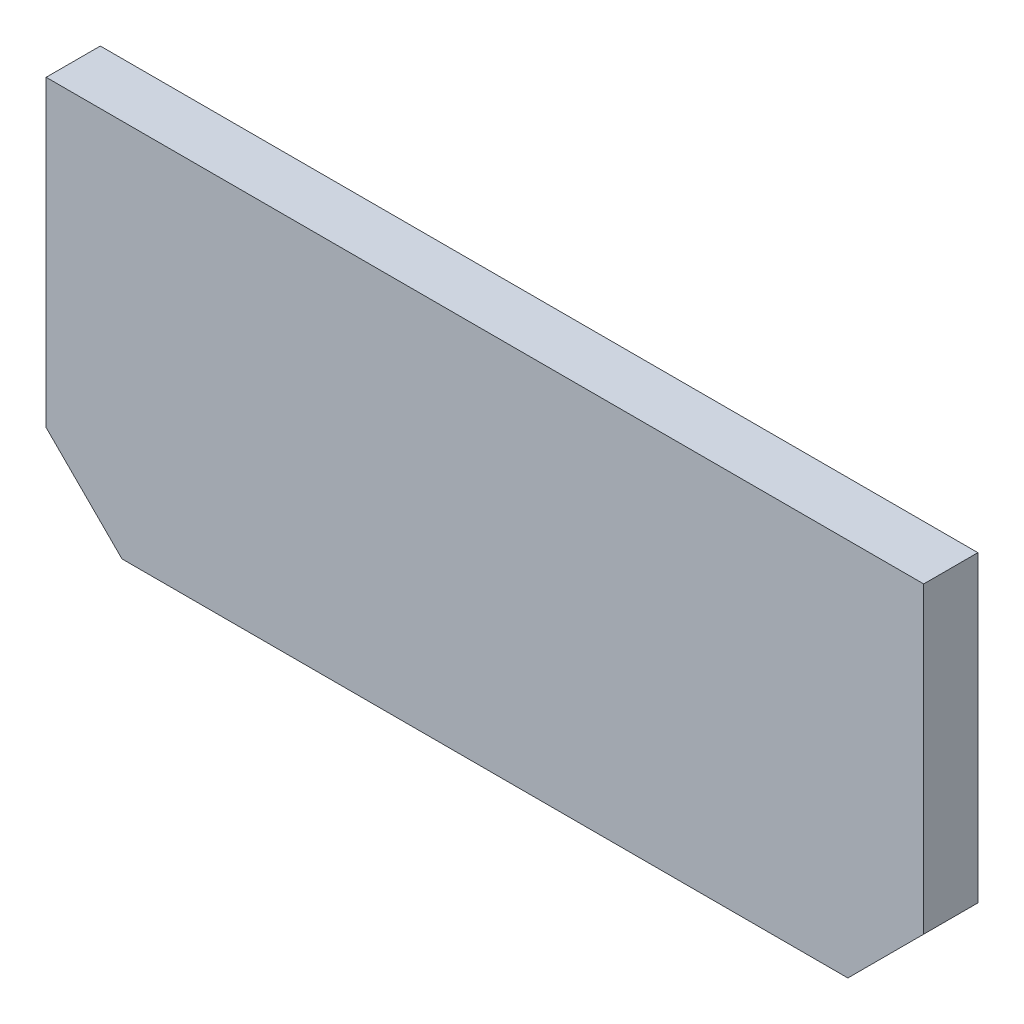
ISO-10303-21;
HEADER;
FILE_DESCRIPTION(('STEP AP214'),'2;1');
FILE_NAME('part.step','',(''),(''),'','','');
FILE_SCHEMA(('AUTOMOTIVE_DESIGN { 1 0 10303 214 1 1 1 1 }'));
ENDSEC;
DATA;
#1=APPLICATION_CONTEXT('core data for automotive mechanical design processes');
#2=APPLICATION_PROTOCOL_DEFINITION('international standard','automotive_design',2000,#1);
#3=PRODUCT_CONTEXT('',#1,'mechanical');
#4=PRODUCT('Part','Part','',(#3));
#5=PRODUCT_RELATED_PRODUCT_CATEGORY('part','',(#4));
#6=PRODUCT_DEFINITION_FORMATION('','',#4);
#7=PRODUCT_DEFINITION_CONTEXT('part definition',#1,'design');
#8=PRODUCT_DEFINITION('design','',#6,#7);
#9=PRODUCT_DEFINITION_SHAPE('','',#8);
#10=(LENGTH_UNIT() NAMED_UNIT(*) SI_UNIT(.MILLI.,.METRE.));
#11=(NAMED_UNIT(*) PLANE_ANGLE_UNIT() SI_UNIT($,.RADIAN.));
#12=(NAMED_UNIT(*) SI_UNIT($,.STERADIAN.) SOLID_ANGLE_UNIT());
#13=UNCERTAINTY_MEASURE_WITH_UNIT(LENGTH_MEASURE(1.E-05),#10,'distance_accuracy_value','');
#14=(GEOMETRIC_REPRESENTATION_CONTEXT(3) GLOBAL_UNCERTAINTY_ASSIGNED_CONTEXT((#13)) GLOBAL_UNIT_ASSIGNED_CONTEXT((#10,
#11,#12)) REPRESENTATION_CONTEXT('',''));
#15=CARTESIAN_POINT('',(0.,0.,0.));
#16=DIRECTION('',(0.,0.,1.));
#17=DIRECTION('',(1.,0.,0.));
#18=AXIS2_PLACEMENT_3D('',#15,#16,#17);
#19=CARTESIAN_POINT('',(-40.5,35.,-2.5));
#20=DIRECTION('',(-1.,0.,0.));
#21=DIRECTION('',(0.,-1.,0.));
#22=AXIS2_PLACEMENT_3D('',#19,#20,#21);
#23=PLANE('',#22);
#24=DIRECTION('',(0.,-1.,0.));
#25=VECTOR('',#24,1.);
#26=CARTESIAN_POINT('',(-40.5,35.,-2.5));
#27=LINE('',#26,#25);
#28=CARTESIAN_POINT('',(-40.5,35.,-2.5));
#29=VERTEX_POINT('',#28);
#30=CARTESIAN_POINT('',(-40.5,7.00000000000001,-2.5));
#31=VERTEX_POINT('',#30);
#32=EDGE_CURVE('E122',#29,#31,#27,.T.);
#33=ORIENTED_EDGE('',*,*,#32,.T.);
#34=DIRECTION('',(0.,0.,1.));
#35=VECTOR('',#34,1.);
#36=CARTESIAN_POINT('',(-40.5,7.00000000000001,-2.5));
#37=LINE('',#36,#35);
#38=CARTESIAN_POINT('',(-40.5,7.00000000000001,2.5));
#39=VERTEX_POINT('',#38);
#40=EDGE_CURVE('E11',#31,#39,#37,.T.);
#41=ORIENTED_EDGE('',*,*,#40,.T.);
#42=DIRECTION('',(0.,-1.,0.));
#43=VECTOR('',#42,1.);
#44=CARTESIAN_POINT('',(-40.5,35.,2.5));
#45=LINE('',#44,#43);
#46=CARTESIAN_POINT('',(-40.5,35.,2.5));
#47=VERTEX_POINT('',#46);
#48=EDGE_CURVE('E128',#47,#39,#45,.T.);
#49=ORIENTED_EDGE('',*,*,#48,.F.);
#50=DIRECTION('',(0.,0.,1.));
#51=VECTOR('',#50,1.);
#52=CARTESIAN_POINT('',(-40.5,35.,-2.5));
#53=LINE('',#52,#51);
#54=EDGE_CURVE('E119',#29,#47,#53,.T.);
#55=ORIENTED_EDGE('',*,*,#54,.F.);
#56=EDGE_LOOP('',(#33,#41,#49,#55));
#57=FACE_BOUND('',#56,.T.);
#58=ADVANCED_FACE('F46',(#57),#23,.T.);
#59=CARTESIAN_POINT('',(40.5,35.,-2.5));
#60=DIRECTION('',(0.,1.,0.));
#61=DIRECTION('',(0.,0.,1.));
#62=AXIS2_PLACEMENT_3D('',#59,#60,#61);
#63=PLANE('',#62);
#64=DIRECTION('',(-1.,0.,0.));
#65=VECTOR('',#64,1.);
#66=CARTESIAN_POINT('',(40.5,35.,2.5));
#67=LINE('',#66,#65);
#68=CARTESIAN_POINT('',(40.5,35.,2.5));
#69=VERTEX_POINT('',#68);
#70=EDGE_CURVE('E117',#69,#47,#67,.T.);
#71=ORIENTED_EDGE('',*,*,#70,.F.);
#72=DIRECTION('',(0.,0.,1.));
#73=VECTOR('',#72,1.);
#74=CARTESIAN_POINT('',(40.5,35.,-2.5));
#75=LINE('',#74,#73);
#76=CARTESIAN_POINT('',(40.5,35.,-2.5));
#77=VERTEX_POINT('',#76);
#78=EDGE_CURVE('E105',#77,#69,#75,.T.);
#79=ORIENTED_EDGE('',*,*,#78,.F.);
#80=DIRECTION('',(-1.,0.,0.));
#81=VECTOR('',#80,1.);
#82=CARTESIAN_POINT('',(40.5,35.,-2.5));
#83=LINE('',#82,#81);
#84=EDGE_CURVE('E110',#77,#29,#83,.T.);
#85=ORIENTED_EDGE('',*,*,#84,.T.);
#86=ORIENTED_EDGE('',*,*,#54,.T.);
#87=EDGE_LOOP('',(#71,#79,#85,#86));
#88=FACE_BOUND('',#87,.T.);
#89=ADVANCED_FACE('F115',(#88),#63,.T.);
#90=CARTESIAN_POINT('',(40.5,0.,-2.5));
#91=DIRECTION('',(1.,0.,0.));
#92=DIRECTION('',(0.,1.,0.));
#93=AXIS2_PLACEMENT_3D('',#90,#91,#92);
#94=PLANE('',#93);
#95=DIRECTION('',(0.,1.,0.));
#96=VECTOR('',#95,1.);
#97=CARTESIAN_POINT('',(40.5,0.,2.5));
#98=LINE('',#97,#96);
#99=CARTESIAN_POINT('',(40.5,7.00000000000003,2.5));
#100=VERTEX_POINT('',#99);
#101=EDGE_CURVE('E136',#100,#69,#98,.T.);
#102=ORIENTED_EDGE('',*,*,#101,.F.);
#103=DIRECTION('',(0.,0.,-1.));
#104=VECTOR('',#103,1.);
#105=CARTESIAN_POINT('',(40.5,7.00000000000003,-2.5));
#106=LINE('',#105,#104);
#107=CARTESIAN_POINT('',(40.5,7.00000000000003,-2.5));
#108=VERTEX_POINT('',#107);
#109=EDGE_CURVE('E71',#100,#108,#106,.T.);
#110=ORIENTED_EDGE('',*,*,#109,.T.);
#111=DIRECTION('',(0.,1.,0.));
#112=VECTOR('',#111,1.);
#113=CARTESIAN_POINT('',(40.5,0.,-2.5));
#114=LINE('',#113,#112);
#115=EDGE_CURVE('E102',#108,#77,#114,.T.);
#116=ORIENTED_EDGE('',*,*,#115,.T.);
#117=ORIENTED_EDGE('',*,*,#78,.T.);
#118=EDGE_LOOP('',(#102,#110,#116,#117));
#119=FACE_BOUND('',#118,.T.);
#120=ADVANCED_FACE('F104',(#119),#94,.T.);
#121=CARTESIAN_POINT('',(-40.5,0.,-2.5));
#122=DIRECTION('',(0.,-1.,0.));
#123=DIRECTION('',(0.,0.,-1.));
#124=AXIS2_PLACEMENT_3D('',#121,#122,#123);
#125=PLANE('',#124);
#126=DIRECTION('',(1.,0.,0.));
#127=VECTOR('',#126,1.);
#128=CARTESIAN_POINT('',(-40.5,0.,-2.5));
#129=LINE('',#128,#127);
#130=CARTESIAN_POINT('',(-33.5,0.,-2.5));
#131=VERTEX_POINT('',#130);
#132=CARTESIAN_POINT('',(33.5,0.,-2.5));
#133=VERTEX_POINT('',#132);
#134=EDGE_CURVE('E111',#131,#133,#129,.T.);
#135=ORIENTED_EDGE('',*,*,#134,.T.);
#136=DIRECTION('',(0.,0.,1.));
#137=VECTOR('',#136,1.);
#138=CARTESIAN_POINT('',(33.5,0.,-2.5));
#139=LINE('',#138,#137);
#140=CARTESIAN_POINT('',(33.5,0.,2.5));
#141=VERTEX_POINT('',#140);
#142=EDGE_CURVE('E146',#133,#141,#139,.T.);
#143=ORIENTED_EDGE('',*,*,#142,.T.);
#144=DIRECTION('',(1.,0.,0.));
#145=VECTOR('',#144,1.);
#146=CARTESIAN_POINT('',(-40.5,0.,2.5));
#147=LINE('',#146,#145);
#148=CARTESIAN_POINT('',(-33.5,0.,2.5));
#149=VERTEX_POINT('',#148);
#150=EDGE_CURVE('E132',#149,#141,#147,.T.);
#151=ORIENTED_EDGE('',*,*,#150,.F.);
#152=DIRECTION('',(0.,0.,-1.));
#153=VECTOR('',#152,1.);
#154=CARTESIAN_POINT('',(-33.5,0.,-2.5));
#155=LINE('',#154,#153);
#156=EDGE_CURVE('E142',#149,#131,#155,.T.);
#157=ORIENTED_EDGE('',*,*,#156,.T.);
#158=EDGE_LOOP('',(#135,#143,#151,#157));
#159=FACE_BOUND('',#158,.T.);
#160=ADVANCED_FACE('F165',(#159),#125,.T.);
#161=CARTESIAN_POINT('',(0.,0.,-2.5));
#162=DIRECTION('',(0.,0.,1.));
#163=DIRECTION('',(1.,0.,0.));
#164=AXIS2_PLACEMENT_3D('',#161,#162,#163);
#165=PLANE('',#164);
#166=ORIENTED_EDGE('',*,*,#115,.F.);
#167=DIRECTION('',(0.707106781186547,0.707106781186548,0.));
#168=VECTOR('',#167,1.);
#169=CARTESIAN_POINT('',(33.5,0.,-2.5));
#170=LINE('',#169,#168);
#171=EDGE_CURVE('E56',#108,#133,#170,.F.);
#172=ORIENTED_EDGE('',*,*,#171,.T.);
#173=ORIENTED_EDGE('',*,*,#134,.F.);
#174=DIRECTION('',(0.707106781186549,-0.707106781186546,0.));
#175=VECTOR('',#174,1.);
#176=CARTESIAN_POINT('',(-40.5,7.00000000000001,-2.5));
#177=LINE('',#176,#175);
#178=EDGE_CURVE('E63',#131,#31,#177,.F.);
#179=ORIENTED_EDGE('',*,*,#178,.T.);
#180=ORIENTED_EDGE('',*,*,#32,.F.);
#181=ORIENTED_EDGE('',*,*,#84,.F.);
#182=EDGE_LOOP('',(#166,#172,#173,#179,#180,#181));
#183=FACE_BOUND('',#182,.T.);
#184=ADVANCED_FACE('F121',(#183),#165,.F.);
#185=CARTESIAN_POINT('',(0.,0.,2.5));
#186=DIRECTION('',(0.,0.,1.));
#187=DIRECTION('',(1.,0.,0.));
#188=AXIS2_PLACEMENT_3D('',#185,#186,#187);
#189=PLANE('',#188);
#190=ORIENTED_EDGE('',*,*,#150,.T.);
#191=DIRECTION('',(-0.707106781186547,-0.707106781186548,0.));
#192=VECTOR('',#191,1.);
#193=CARTESIAN_POINT('',(16.75,-16.75,2.5));
#194=LINE('',#193,#192);
#195=EDGE_CURVE('E153',#141,#100,#194,.F.);
#196=ORIENTED_EDGE('',*,*,#195,.T.);
#197=ORIENTED_EDGE('',*,*,#101,.T.);
#198=ORIENTED_EDGE('',*,*,#70,.T.);
#199=ORIENTED_EDGE('',*,*,#48,.T.);
#200=DIRECTION('',(-0.707106781186549,0.707106781186546,0.));
#201=VECTOR('',#200,1.);
#202=CARTESIAN_POINT('',(-16.7499999999999,-16.75,2.5));
#203=LINE('',#202,#201);
#204=EDGE_CURVE('E150',#39,#149,#203,.F.);
#205=ORIENTED_EDGE('',*,*,#204,.T.);
#206=EDGE_LOOP('',(#190,#196,#197,#198,#199,#205));
#207=FACE_BOUND('',#206,.T.);
#208=ADVANCED_FACE('F171',(#207),#189,.T.);
#209=CARTESIAN_POINT('',(33.5,0.,-2.5));
#210=DIRECTION('',(-0.707106781186548,0.707106781186547,0.));
#211=DIRECTION('',(0.,0.,1.));
#212=AXIS2_PLACEMENT_3D('',#209,#210,#211);
#213=PLANE('',#212);
#214=ORIENTED_EDGE('',*,*,#171,.F.);
#215=ORIENTED_EDGE('',*,*,#109,.F.);
#216=ORIENTED_EDGE('',*,*,#195,.F.);
#217=ORIENTED_EDGE('',*,*,#142,.F.);
#218=EDGE_LOOP('',(#214,#215,#216,#217));
#219=FACE_BOUND('',#218,.T.);
#220=ADVANCED_FACE('F169',(#219),#213,.F.);
#221=CARTESIAN_POINT('',(-40.5,7.00000000000001,-2.5));
#222=DIRECTION('',(0.707106781186546,0.707106781186549,0.));
#223=DIRECTION('',(0.,0.,1.));
#224=AXIS2_PLACEMENT_3D('',#221,#222,#223);
#225=PLANE('',#224);
#226=ORIENTED_EDGE('',*,*,#178,.F.);
#227=ORIENTED_EDGE('',*,*,#156,.F.);
#228=ORIENTED_EDGE('',*,*,#204,.F.);
#229=ORIENTED_EDGE('',*,*,#40,.F.);
#230=EDGE_LOOP('',(#226,#227,#228,#229));
#231=FACE_BOUND('',#230,.T.);
#232=ADVANCED_FACE('F49',(#231),#225,.F.);
#233=CLOSED_SHELL('',(#58,#89,#120,#160,#184,#208,#220,#232));
#234=MANIFOLD_SOLID_BREP('B2',#233);
#235=ADVANCED_BREP_SHAPE_REPRESENTATION('',(#18,#234),#14);
#236=SHAPE_DEFINITION_REPRESENTATION(#9,#235);
ENDSEC;
END-ISO-10303-21;
